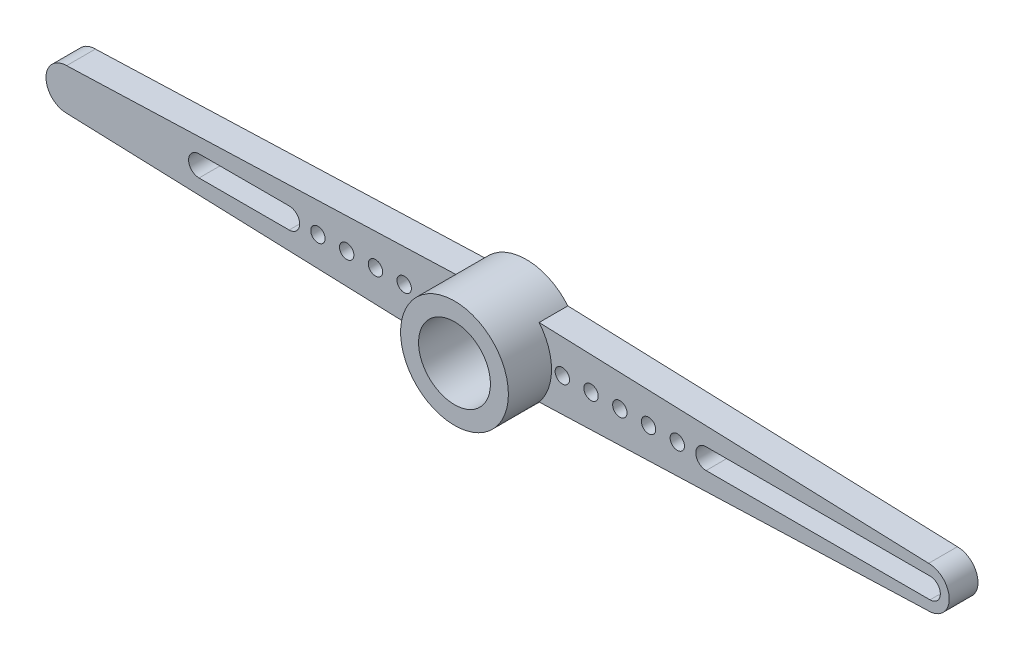
ISO-10303-21;
HEADER;
FILE_DESCRIPTION(('STEP AP214'),'2;1');
FILE_NAME('part.step','',(''),(''),'','','');
FILE_SCHEMA(('AUTOMOTIVE_DESIGN { 1 0 10303 214 1 1 1 1 }'));
ENDSEC;
DATA;
#1=APPLICATION_CONTEXT('core data for automotive mechanical design processes');
#2=APPLICATION_PROTOCOL_DEFINITION('international standard','automotive_design',2000,#1);
#3=PRODUCT_CONTEXT('',#1,'mechanical');
#4=PRODUCT('Part','Part','',(#3));
#5=PRODUCT_RELATED_PRODUCT_CATEGORY('part','',(#4));
#6=PRODUCT_DEFINITION_FORMATION('','',#4);
#7=PRODUCT_DEFINITION_CONTEXT('part definition',#1,'design');
#8=PRODUCT_DEFINITION('design','',#6,#7);
#9=PRODUCT_DEFINITION_SHAPE('','',#8);
#10=(LENGTH_UNIT() NAMED_UNIT(*) SI_UNIT(.MILLI.,.METRE.));
#11=(NAMED_UNIT(*) PLANE_ANGLE_UNIT() SI_UNIT($,.RADIAN.));
#12=(NAMED_UNIT(*) SI_UNIT($,.STERADIAN.) SOLID_ANGLE_UNIT());
#13=UNCERTAINTY_MEASURE_WITH_UNIT(LENGTH_MEASURE(1.E-05),#10,'distance_accuracy_value','');
#14=(GEOMETRIC_REPRESENTATION_CONTEXT(3) GLOBAL_UNCERTAINTY_ASSIGNED_CONTEXT((#13)) GLOBAL_UNIT_ASSIGNED_CONTEXT((#10,
#11,#12)) REPRESENTATION_CONTEXT('',''));
#15=CARTESIAN_POINT('',(0.,0.,0.));
#16=DIRECTION('',(0.,0.,1.));
#17=DIRECTION('',(1.,0.,0.));
#18=AXIS2_PLACEMENT_3D('',#15,#16,#17);
#19=CARTESIAN_POINT('',(0.,0.,0.));
#20=DIRECTION('',(0.,0.,1.));
#21=DIRECTION('',(1.,0.,0.));
#22=AXIS2_PLACEMENT_3D('',#19,#20,#21);
#23=CYLINDRICAL_SURFACE('',#22,2.5);
#24=CARTESIAN_POINT('',(0.,0.,5.));
#25=DIRECTION('',(0.,0.,1.));
#26=DIRECTION('',(1.,0.,0.));
#27=AXIS2_PLACEMENT_3D('',#24,#25,#26);
#28=CIRCLE('',#27,2.5);
#29=CARTESIAN_POINT('',(2.5,0.,5.));
#30=VERTEX_POINT('',#29);
#31=EDGE_CURVE('E299',#30,#30,#28,.T.);
#32=ORIENTED_EDGE('',*,*,#31,.T.);
#33=EDGE_LOOP('',(#32));
#34=FACE_BOUND('',#33,.T.);
#35=CARTESIAN_POINT('',(0.,0.,1.));
#36=DIRECTION('',(0.,0.,-1.));
#37=DIRECTION('',(-1.,0.,0.));
#38=AXIS2_PLACEMENT_3D('',#35,#36,#37);
#39=CIRCLE('',#38,2.5);
#40=CARTESIAN_POINT('',(-2.5,0.,1.));
#41=VERTEX_POINT('',#40);
#42=EDGE_CURVE('E236',#41,#41,#39,.T.);
#43=ORIENTED_EDGE('',*,*,#42,.T.);
#44=EDGE_LOOP('',(#43));
#45=FACE_BOUND('',#44,.T.);
#46=ADVANCED_FACE('F43',(#34,#45),#23,.F.);
#47=CARTESIAN_POINT('',(0.,0.,2.));
#48=DIRECTION('',(0.,0.,1.));
#49=DIRECTION('',(1.,0.,0.));
#50=AXIS2_PLACEMENT_3D('',#47,#48,#49);
#51=PLANE('',#50);
#52=CARTESIAN_POINT('',(-20.7702629513184,2.76649775136915E-07,2.));
#53=DIRECTION('',(0.,0.,-1.));
#54=DIRECTION('',(-1.,0.,0.));
#55=AXIS2_PLACEMENT_3D('',#52,#53,#54);
#56=CIRCLE('',#55,0.726731665091719);
#57=CARTESIAN_POINT('',(-20.7702629513184,-0.726731665091719,2.));
#58=VERTEX_POINT('',#57);
#59=CARTESIAN_POINT('',(-20.7702629513184,0.726731665091719,2.));
#60=VERTEX_POINT('',#59);
#61=EDGE_CURVE('E160',#58,#60,#56,.T.);
#62=ORIENTED_EDGE('',*,*,#61,.T.);
#63=DIRECTION('',(1.,0.,0.));
#64=VECTOR('',#63,1.);
#65=CARTESIAN_POINT('',(-20.7702629513184,0.726731665091719,2.));
#66=LINE('',#65,#64);
#67=CARTESIAN_POINT('',(-14.5,0.726731665091716,2.));
#68=VERTEX_POINT('',#67);
#69=EDGE_CURVE('E169',#60,#68,#66,.T.);
#70=ORIENTED_EDGE('',*,*,#69,.T.);
#71=CARTESIAN_POINT('',(-14.5,0.,2.));
#72=DIRECTION('',(0.,0.,-1.));
#73=DIRECTION('',(-1.,0.,0.));
#74=AXIS2_PLACEMENT_3D('',#71,#72,#73);
#75=CIRCLE('',#74,0.726731665091718);
#76=CARTESIAN_POINT('',(-14.5,-0.72673166509172,2.));
#77=VERTEX_POINT('',#76);
#78=EDGE_CURVE('E60',#68,#77,#75,.T.);
#79=ORIENTED_EDGE('',*,*,#78,.T.);
#80=DIRECTION('',(-1.,0.,0.));
#81=VECTOR('',#80,1.);
#82=CARTESIAN_POINT('',(-20.7702629513184,-0.726731665091719,2.));
#83=LINE('',#82,#81);
#84=EDGE_CURVE('E166',#77,#58,#83,.T.);
#85=ORIENTED_EDGE('',*,*,#84,.T.);
#86=EDGE_LOOP('',(#62,#70,#79,#85));
#87=FACE_BOUND('',#86,.T.);
#88=CARTESIAN_POINT('',(-12.5,0.,2.));
#89=DIRECTION('',(0.,0.,-1.));
#90=DIRECTION('',(-1.,0.,0.));
#91=AXIS2_PLACEMENT_3D('',#88,#89,#90);
#92=CIRCLE('',#91,0.500000000000001);
#93=CARTESIAN_POINT('',(-13.,0.,2.));
#94=VERTEX_POINT('',#93);
#95=EDGE_CURVE('E245',#94,#94,#92,.F.);
#96=ORIENTED_EDGE('',*,*,#95,.F.);
#97=EDGE_LOOP('',(#96));
#98=FACE_BOUND('',#97,.T.);
#99=CARTESIAN_POINT('',(-8.5,0.,2.));
#100=DIRECTION('',(0.,0.,-1.));
#101=DIRECTION('',(-1.,0.,0.));
#102=AXIS2_PLACEMENT_3D('',#99,#100,#101);
#103=CIRCLE('',#102,0.500000000000001);
#104=CARTESIAN_POINT('',(-9.,0.,2.));
#105=VERTEX_POINT('',#104);
#106=EDGE_CURVE('E257',#105,#105,#103,.F.);
#107=ORIENTED_EDGE('',*,*,#106,.F.);
#108=EDGE_LOOP('',(#107));
#109=FACE_BOUND('',#108,.T.);
#110=CARTESIAN_POINT('',(-4.5,0.,2.));
#111=DIRECTION('',(0.,0.,-1.));
#112=DIRECTION('',(-1.,0.,0.));
#113=AXIS2_PLACEMENT_3D('',#110,#111,#112);
#114=CIRCLE('',#113,0.500000000000001);
#115=CARTESIAN_POINT('',(-5.,0.,2.));
#116=VERTEX_POINT('',#115);
#117=EDGE_CURVE('E269',#116,#116,#114,.F.);
#118=ORIENTED_EDGE('',*,*,#117,.F.);
#119=EDGE_LOOP('',(#118));
#120=FACE_BOUND('',#119,.T.);
#121=CARTESIAN_POINT('',(0.,0.,2.));
#122=DIRECTION('',(0.,0.,1.));
#123=DIRECTION('',(1.,0.,0.));
#124=AXIS2_PLACEMENT_3D('',#121,#122,#123);
#125=CIRCLE('',#124,3.75);
#126=CARTESIAN_POINT('',(-2.88547071027724,2.39511143376089,2.));
#127=VERTEX_POINT('',#126);
#128=CARTESIAN_POINT('',(-2.88547071027724,-2.39511143376089,2.));
#129=VERTEX_POINT('',#128);
#130=EDGE_CURVE('E12',#127,#129,#125,.T.);
#131=ORIENTED_EDGE('',*,*,#130,.F.);
#132=DIRECTION('',(0.999372730394994,0.0354139201848026,0.));
#133=VECTOR('',#132,1.);
#134=CARTESIAN_POINT('',(-0.0883858807695831,2.49422934631706,2.));
#135=LINE('',#134,#133);
#136=CARTESIAN_POINT('',(-29.9811819118498,1.43494379594303,2.));
#137=VERTEX_POINT('',#136);
#138=EDGE_CURVE('E321',#137,#127,#135,.T.);
#139=ORIENTED_EDGE('',*,*,#138,.F.);
#140=CARTESIAN_POINT('',(-29.9811819118498,0.,2.));
#141=DIRECTION('',(0.,0.,1.));
#142=DIRECTION('',(1.,0.,0.));
#143=AXIS2_PLACEMENT_3D('',#140,#141,#142);
#144=CIRCLE('',#143,1.43494379594303);
#145=CARTESIAN_POINT('',(-29.9811819118498,-1.43494379594303,2.));
#146=VERTEX_POINT('',#145);
#147=EDGE_CURVE('E308',#146,#137,#144,.F.);
#148=ORIENTED_EDGE('',*,*,#147,.F.);
#149=DIRECTION('',(0.999372730394994,-0.0354139201848024,0.));
#150=VECTOR('',#149,1.);
#151=CARTESIAN_POINT('',(-0.0883858807695825,-2.49422934631706,2.));
#152=LINE('',#151,#150);
#153=EDGE_CURVE('E311',#146,#129,#152,.T.);
#154=ORIENTED_EDGE('',*,*,#153,.T.);
#155=EDGE_LOOP('',(#131,#139,#148,#154));
#156=FACE_BOUND('',#155,.T.);
#157=CARTESIAN_POINT('',(-6.5,0.,2.));
#158=DIRECTION('',(0.,0.,-1.));
#159=DIRECTION('',(-1.,0.,0.));
#160=AXIS2_PLACEMENT_3D('',#157,#158,#159);
#161=CIRCLE('',#160,0.500000000000001);
#162=CARTESIAN_POINT('',(-7.,0.,2.));
#163=VERTEX_POINT('',#162);
#164=EDGE_CURVE('E263',#163,#163,#161,.F.);
#165=ORIENTED_EDGE('',*,*,#164,.F.);
#166=EDGE_LOOP('',(#165));
#167=FACE_BOUND('',#166,.T.);
#168=CARTESIAN_POINT('',(-10.5,0.,2.));
#169=DIRECTION('',(0.,0.,-1.));
#170=DIRECTION('',(-1.,0.,0.));
#171=AXIS2_PLACEMENT_3D('',#168,#169,#170);
#172=CIRCLE('',#171,0.500000000000001);
#173=CARTESIAN_POINT('',(-11.,0.,2.));
#174=VERTEX_POINT('',#173);
#175=EDGE_CURVE('E251',#174,#174,#172,.F.);
#176=ORIENTED_EDGE('',*,*,#175,.F.);
#177=EDGE_LOOP('',(#176));
#178=FACE_BOUND('',#177,.T.);
#179=ADVANCED_FACE('F173',(#87,#98,#109,#120,#156,#167,#178),#51,.T.);
#180=CARTESIAN_POINT('',(0.,0.,0.));
#181=DIRECTION('',(0.,0.,1.));
#182=DIRECTION('',(1.,0.,0.));
#183=AXIS2_PLACEMENT_3D('',#180,#181,#182);
#184=PLANE('',#183);
#185=DIRECTION('',(1.,0.,0.));
#186=VECTOR('',#185,1.);
#187=CARTESIAN_POINT('',(-20.7702629513184,0.726731665091719,0.));
#188=LINE('',#187,#186);
#189=CARTESIAN_POINT('',(-20.7702629513184,0.726731665091719,0.));
#190=VERTEX_POINT('',#189);
#191=CARTESIAN_POINT('',(-14.5,0.726731665091718,0.));
#192=VERTEX_POINT('',#191);
#193=EDGE_CURVE('E185',#190,#192,#188,.T.);
#194=ORIENTED_EDGE('',*,*,#193,.F.);
#195=CARTESIAN_POINT('',(-20.7702629513184,2.76649775136915E-07,0.));
#196=DIRECTION('',(0.,0.,-1.));
#197=DIRECTION('',(-1.,0.,0.));
#198=AXIS2_PLACEMENT_3D('',#195,#196,#197);
#199=CIRCLE('',#198,0.726731665091719);
#200=CARTESIAN_POINT('',(-20.7702629513184,-0.726731665091719,0.));
#201=VERTEX_POINT('',#200);
#202=EDGE_CURVE('E68',#201,#190,#199,.T.);
#203=ORIENTED_EDGE('',*,*,#202,.F.);
#204=DIRECTION('',(-1.,0.,0.));
#205=VECTOR('',#204,1.);
#206=CARTESIAN_POINT('',(-20.7702629513184,-0.726731665091719,0.));
#207=LINE('',#206,#205);
#208=CARTESIAN_POINT('',(-14.5,-0.72673166509172,0.));
#209=VERTEX_POINT('',#208);
#210=EDGE_CURVE('E176',#209,#201,#207,.T.);
#211=ORIENTED_EDGE('',*,*,#210,.F.);
#212=CARTESIAN_POINT('',(-14.5,0.,0.));
#213=DIRECTION('',(0.,0.,-1.));
#214=DIRECTION('',(-1.,0.,0.));
#215=AXIS2_PLACEMENT_3D('',#212,#213,#214);
#216=CIRCLE('',#215,0.726731665091718);
#217=EDGE_CURVE('E179',#192,#209,#216,.T.);
#218=ORIENTED_EDGE('',*,*,#217,.F.);
#219=EDGE_LOOP('',(#194,#203,#211,#218));
#220=FACE_BOUND('',#219,.T.);
#221=DIRECTION('',(1.,0.,0.));
#222=VECTOR('',#221,1.);
#223=CARTESIAN_POINT('',(14.5,0.716032824435331,0.));
#224=LINE('',#223,#222);
#225=CARTESIAN_POINT('',(14.5,0.716032824435331,0.));
#226=VERTEX_POINT('',#225);
#227=CARTESIAN_POINT('',(30.0791053530389,0.716032824435331,0.));
#228=VERTEX_POINT('',#227);
#229=EDGE_CURVE('E212',#226,#228,#224,.T.);
#230=ORIENTED_EDGE('',*,*,#229,.F.);
#231=CARTESIAN_POINT('',(14.5,0.,0.));
#232=DIRECTION('',(0.,0.,-1.));
#233=DIRECTION('',(-1.,0.,0.));
#234=AXIS2_PLACEMENT_3D('',#231,#232,#233);
#235=CIRCLE('',#234,0.716032824435331);
#236=CARTESIAN_POINT('',(14.5,-0.716032824435331,0.));
#237=VERTEX_POINT('',#236);
#238=EDGE_CURVE('E210',#237,#226,#235,.T.);
#239=ORIENTED_EDGE('',*,*,#238,.F.);
#240=DIRECTION('',(-1.,0.,0.));
#241=VECTOR('',#240,1.);
#242=CARTESIAN_POINT('',(14.5,-0.716032824435331,0.));
#243=LINE('',#242,#241);
#244=CARTESIAN_POINT('',(30.0791053530389,-0.716032824435331,0.));
#245=VERTEX_POINT('',#244);
#246=EDGE_CURVE('E200',#245,#237,#243,.T.);
#247=ORIENTED_EDGE('',*,*,#246,.F.);
#248=CARTESIAN_POINT('',(30.0791053530389,0.,0.));
#249=DIRECTION('',(0.,0.,-1.));
#250=DIRECTION('',(-1.,0.,0.));
#251=AXIS2_PLACEMENT_3D('',#248,#249,#250);
#252=CIRCLE('',#251,0.716032824435331);
#253=EDGE_CURVE('E215',#228,#245,#252,.T.);
#254=ORIENTED_EDGE('',*,*,#253,.F.);
#255=EDGE_LOOP('',(#230,#239,#247,#254));
#256=FACE_BOUND('',#255,.T.);
#257=CARTESIAN_POINT('',(0.,0.,0.));
#258=DIRECTION('',(0.,0.,-1.));
#259=DIRECTION('',(-1.,0.,0.));
#260=AXIS2_PLACEMENT_3D('',#257,#258,#259);
#261=CIRCLE('',#260,2.5);
#262=CARTESIAN_POINT('',(-2.5,0.,0.));
#263=VERTEX_POINT('',#262);
#264=EDGE_CURVE('E232',#263,#263,#261,.T.);
#265=ORIENTED_EDGE('',*,*,#264,.F.);
#266=EDGE_LOOP('',(#265));
#267=FACE_BOUND('',#266,.T.);
#268=CARTESIAN_POINT('',(12.5,0.,0.));
#269=DIRECTION('',(0.,0.,-1.));
#270=DIRECTION('',(-1.,0.,0.));
#271=AXIS2_PLACEMENT_3D('',#268,#269,#270);
#272=CIRCLE('',#271,0.500000000000001);
#273=CARTESIAN_POINT('',(12.,0.,0.));
#274=VERTEX_POINT('',#273);
#275=EDGE_CURVE('E242',#274,#274,#272,.T.);
#276=ORIENTED_EDGE('',*,*,#275,.F.);
#277=EDGE_LOOP('',(#276));
#278=FACE_BOUND('',#277,.T.);
#279=CARTESIAN_POINT('',(4.5,0.,0.));
#280=DIRECTION('',(0.,0.,-1.));
#281=DIRECTION('',(-1.,0.,0.));
#282=AXIS2_PLACEMENT_3D('',#279,#280,#281);
#283=CIRCLE('',#282,0.500000000000001);
#284=CARTESIAN_POINT('',(4.,0.,0.));
#285=VERTEX_POINT('',#284);
#286=EDGE_CURVE('E278',#285,#285,#283,.T.);
#287=ORIENTED_EDGE('',*,*,#286,.F.);
#288=EDGE_LOOP('',(#287));
#289=FACE_BOUND('',#288,.T.);
#290=CARTESIAN_POINT('',(6.5,0.,0.));
#291=DIRECTION('',(0.,0.,-1.));
#292=DIRECTION('',(-1.,0.,0.));
#293=AXIS2_PLACEMENT_3D('',#290,#291,#292);
#294=CIRCLE('',#293,0.500000000000001);
#295=CARTESIAN_POINT('',(6.,0.,0.));
#296=VERTEX_POINT('',#295);
#297=EDGE_CURVE('E284',#296,#296,#294,.T.);
#298=ORIENTED_EDGE('',*,*,#297,.F.);
#299=EDGE_LOOP('',(#298));
#300=FACE_BOUND('',#299,.T.);
#301=CARTESIAN_POINT('',(8.5,0.,0.));
#302=DIRECTION('',(0.,0.,-1.));
#303=DIRECTION('',(-1.,0.,0.));
#304=AXIS2_PLACEMENT_3D('',#301,#302,#303);
#305=CIRCLE('',#304,0.500000000000001);
#306=CARTESIAN_POINT('',(8.,0.,0.));
#307=VERTEX_POINT('',#306);
#308=EDGE_CURVE('E290',#307,#307,#305,.T.);
#309=ORIENTED_EDGE('',*,*,#308,.F.);
#310=EDGE_LOOP('',(#309));
#311=FACE_BOUND('',#310,.T.);
#312=CARTESIAN_POINT('',(10.5,0.,0.));
#313=DIRECTION('',(0.,0.,-1.));
#314=DIRECTION('',(-1.,0.,0.));
#315=AXIS2_PLACEMENT_3D('',#312,#313,#314);
#316=CIRCLE('',#315,0.500000000000001);
#317=CARTESIAN_POINT('',(10.,0.,0.));
#318=VERTEX_POINT('',#317);
#319=EDGE_CURVE('E296',#318,#318,#316,.T.);
#320=ORIENTED_EDGE('',*,*,#319,.F.);
#321=EDGE_LOOP('',(#320));
#322=FACE_BOUND('',#321,.T.);
#323=DIRECTION('',(-0.999372730394994,-0.0354139201848029,0.));
#324=VECTOR('',#323,1.);
#325=CARTESIAN_POINT('',(0.0883858807695838,-2.49422934631706,0.));
#326=LINE('',#325,#324);
#327=CARTESIAN_POINT('',(29.9811819118498,-1.43494379594302,0.));
#328=VERTEX_POINT('',#327);
#329=CARTESIAN_POINT('',(2.88547071027724,-2.39511143376089,0.));
#330=VERTEX_POINT('',#329);
#331=EDGE_CURVE('E329',#328,#330,#326,.T.);
#332=ORIENTED_EDGE('',*,*,#331,.T.);
#333=CARTESIAN_POINT('',(0.,0.,0.));
#334=DIRECTION('',(0.,0.,-1.));
#335=DIRECTION('',(-1.,0.,0.));
#336=AXIS2_PLACEMENT_3D('',#333,#334,#335);
#337=CIRCLE('',#336,3.75);
#338=CARTESIAN_POINT('',(-2.88547071027724,-2.39511143376089,0.));
#339=VERTEX_POINT('',#338);
#340=EDGE_CURVE('E326',#330,#339,#337,.T.);
#341=ORIENTED_EDGE('',*,*,#340,.T.);
#342=DIRECTION('',(0.999372730394994,-0.0354139201848024,0.));
#343=VECTOR('',#342,1.);
#344=CARTESIAN_POINT('',(-0.0883858807695825,-2.49422934631706,0.));
#345=LINE('',#344,#343);
#346=CARTESIAN_POINT('',(-29.9811819118498,-1.43494379594303,0.));
#347=VERTEX_POINT('',#346);
#348=EDGE_CURVE('E315',#347,#339,#345,.T.);
#349=ORIENTED_EDGE('',*,*,#348,.F.);
#350=CARTESIAN_POINT('',(-29.9811819118498,0.,0.));
#351=DIRECTION('',(0.,0.,1.));
#352=DIRECTION('',(1.,0.,0.));
#353=AXIS2_PLACEMENT_3D('',#350,#351,#352);
#354=CIRCLE('',#353,1.43494379594303);
#355=CARTESIAN_POINT('',(-29.9811819118498,1.43494379594303,0.));
#356=VERTEX_POINT('',#355);
#357=EDGE_CURVE('E307',#347,#356,#354,.F.);
#358=ORIENTED_EDGE('',*,*,#357,.T.);
#359=DIRECTION('',(0.999372730394994,0.0354139201848026,0.));
#360=VECTOR('',#359,1.);
#361=CARTESIAN_POINT('',(-0.0883858807695831,2.49422934631706,0.));
#362=LINE('',#361,#360);
#363=CARTESIAN_POINT('',(-2.88547071027724,2.39511143376089,0.));
#364=VERTEX_POINT('',#363);
#365=EDGE_CURVE('E312',#356,#364,#362,.T.);
#366=ORIENTED_EDGE('',*,*,#365,.T.);
#367=CARTESIAN_POINT('',(2.88547071027724,2.39511143376089,0.));
#368=VERTEX_POINT('',#367);
#369=EDGE_CURVE('E324',#364,#368,#337,.T.);
#370=ORIENTED_EDGE('',*,*,#369,.T.);
#371=DIRECTION('',(-0.999372730394994,0.0354139201848023,0.));
#372=VECTOR('',#371,1.);
#373=CARTESIAN_POINT('',(0.0883858807695825,2.49422934631706,0.));
#374=LINE('',#373,#372);
#375=CARTESIAN_POINT('',(29.9811819118498,1.43494379594303,0.));
#376=VERTEX_POINT('',#375);
#377=EDGE_CURVE('E338',#376,#368,#374,.T.);
#378=ORIENTED_EDGE('',*,*,#377,.F.);
#379=CARTESIAN_POINT('',(29.9811819118498,0.,0.));
#380=DIRECTION('',(0.,0.,1.));
#381=DIRECTION('',(1.,0.,0.));
#382=AXIS2_PLACEMENT_3D('',#379,#380,#381);
#383=CIRCLE('',#382,1.43494379594303);
#384=EDGE_CURVE('E336',#328,#376,#383,.T.);
#385=ORIENTED_EDGE('',*,*,#384,.F.);
#386=EDGE_LOOP('',(#332,#341,#349,#358,#366,#370,#378,#385));
#387=FACE_BOUND('',#386,.T.);
#388=CARTESIAN_POINT('',(-4.5,0.,0.));
#389=DIRECTION('',(0.,0.,-1.));
#390=DIRECTION('',(-1.,0.,0.));
#391=AXIS2_PLACEMENT_3D('',#388,#389,#390);
#392=CIRCLE('',#391,0.500000000000001);
#393=CARTESIAN_POINT('',(-5.,0.,0.));
#394=VERTEX_POINT('',#393);
#395=EDGE_CURVE('E272',#394,#394,#392,.F.);
#396=ORIENTED_EDGE('',*,*,#395,.T.);
#397=EDGE_LOOP('',(#396));
#398=FACE_BOUND('',#397,.T.);
#399=CARTESIAN_POINT('',(-6.5,0.,0.));
#400=DIRECTION('',(0.,0.,-1.));
#401=DIRECTION('',(-1.,0.,0.));
#402=AXIS2_PLACEMENT_3D('',#399,#400,#401);
#403=CIRCLE('',#402,0.500000000000001);
#404=CARTESIAN_POINT('',(-7.,0.,0.));
#405=VERTEX_POINT('',#404);
#406=EDGE_CURVE('E266',#405,#405,#403,.F.);
#407=ORIENTED_EDGE('',*,*,#406,.T.);
#408=EDGE_LOOP('',(#407));
#409=FACE_BOUND('',#408,.T.);
#410=CARTESIAN_POINT('',(-8.5,0.,0.));
#411=DIRECTION('',(0.,0.,-1.));
#412=DIRECTION('',(-1.,0.,0.));
#413=AXIS2_PLACEMENT_3D('',#410,#411,#412);
#414=CIRCLE('',#413,0.500000000000001);
#415=CARTESIAN_POINT('',(-9.,0.,0.));
#416=VERTEX_POINT('',#415);
#417=EDGE_CURVE('E260',#416,#416,#414,.F.);
#418=ORIENTED_EDGE('',*,*,#417,.T.);
#419=EDGE_LOOP('',(#418));
#420=FACE_BOUND('',#419,.T.);
#421=CARTESIAN_POINT('',(-10.5,0.,0.));
#422=DIRECTION('',(0.,0.,-1.));
#423=DIRECTION('',(-1.,0.,0.));
#424=AXIS2_PLACEMENT_3D('',#421,#422,#423);
#425=CIRCLE('',#424,0.500000000000001);
#426=CARTESIAN_POINT('',(-11.,0.,0.));
#427=VERTEX_POINT('',#426);
#428=EDGE_CURVE('E254',#427,#427,#425,.F.);
#429=ORIENTED_EDGE('',*,*,#428,.T.);
#430=EDGE_LOOP('',(#429));
#431=FACE_BOUND('',#430,.T.);
#432=CARTESIAN_POINT('',(-12.5,0.,0.));
#433=DIRECTION('',(0.,0.,-1.));
#434=DIRECTION('',(-1.,0.,0.));
#435=AXIS2_PLACEMENT_3D('',#432,#433,#434);
#436=CIRCLE('',#435,0.500000000000001);
#437=CARTESIAN_POINT('',(-13.,0.,0.));
#438=VERTEX_POINT('',#437);
#439=EDGE_CURVE('E248',#438,#438,#436,.F.);
#440=ORIENTED_EDGE('',*,*,#439,.T.);
#441=EDGE_LOOP('',(#440));
#442=FACE_BOUND('',#441,.T.);
#443=ADVANCED_FACE('F385',(#220,#256,#267,#278,#289,#300,#311,#322,#387,#398,#409,#420,#431,
#442),#184,.F.);
#444=CARTESIAN_POINT('',(0.0883858807695838,-2.49422934631706,2.));
#445=DIRECTION('',(0.0354139201848029,-0.999372730394994,0.));
#446=DIRECTION('',(0.999372730394994,0.0354139201848029,0.));
#447=AXIS2_PLACEMENT_3D('',#444,#445,#446);
#448=PLANE('',#447);
#449=ORIENTED_EDGE('',*,*,#331,.F.);
#450=DIRECTION('',(0.,0.,-1.));
#451=VECTOR('',#450,1.);
#452=CARTESIAN_POINT('',(29.9811819118498,-1.43494379594302,2.));
#453=LINE('',#452,#451);
#454=CARTESIAN_POINT('',(29.9811819118498,-1.43494379594302,2.));
#455=VERTEX_POINT('',#454);
#456=EDGE_CURVE('E344',#455,#328,#453,.T.);
#457=ORIENTED_EDGE('',*,*,#456,.F.);
#458=DIRECTION('',(-0.999372730394994,-0.0354139201848029,0.));
#459=VECTOR('',#458,1.);
#460=CARTESIAN_POINT('',(0.0883858807695838,-2.49422934631706,2.));
#461=LINE('',#460,#459);
#462=CARTESIAN_POINT('',(2.88547071027724,-2.39511143376089,2.));
#463=VERTEX_POINT('',#462);
#464=EDGE_CURVE('E333',#455,#463,#461,.T.);
#465=ORIENTED_EDGE('',*,*,#464,.T.);
#466=DIRECTION('',(0.,0.,-1.));
#467=VECTOR('',#466,1.);
#468=CARTESIAN_POINT('',(2.88547071027724,-2.39511143376089,2.));
#469=LINE('',#468,#467);
#470=EDGE_CURVE('E359',#463,#330,#469,.T.);
#471=ORIENTED_EDGE('',*,*,#470,.T.);
#472=EDGE_LOOP('',(#449,#457,#465,#471));
#473=FACE_BOUND('',#472,.T.);
#474=ADVANCED_FACE('F45',(#473),#448,.T.);
#475=CARTESIAN_POINT('',(29.9811819118498,0.,2.));
#476=DIRECTION('',(0.,0.,-1.));
#477=DIRECTION('',(-1.,0.,0.));
#478=AXIS2_PLACEMENT_3D('',#475,#476,#477);
#479=CYLINDRICAL_SURFACE('',#478,1.43494379594303);
#480=ORIENTED_EDGE('',*,*,#384,.T.);
#481=DIRECTION('',(0.,0.,-1.));
#482=VECTOR('',#481,1.);
#483=CARTESIAN_POINT('',(29.9811819118498,1.43494379594303,2.));
#484=LINE('',#483,#482);
#485=CARTESIAN_POINT('',(29.9811819118498,1.43494379594303,2.));
#486=VERTEX_POINT('',#485);
#487=EDGE_CURVE('E341',#486,#376,#484,.T.);
#488=ORIENTED_EDGE('',*,*,#487,.F.);
#489=CARTESIAN_POINT('',(29.9811819118498,0.,2.));
#490=DIRECTION('',(0.,0.,1.));
#491=DIRECTION('',(1.,0.,0.));
#492=AXIS2_PLACEMENT_3D('',#489,#490,#491);
#493=CIRCLE('',#492,1.43494379594303);
#494=EDGE_CURVE('E330',#455,#486,#493,.T.);
#495=ORIENTED_EDGE('',*,*,#494,.F.);
#496=ORIENTED_EDGE('',*,*,#456,.T.);
#497=EDGE_LOOP('',(#480,#488,#495,#496));
#498=FACE_BOUND('',#497,.T.);
#499=ADVANCED_FACE('F391',(#498),#479,.T.);
#500=CARTESIAN_POINT('',(0.0883858807695825,2.49422934631706,2.));
#501=DIRECTION('',(-0.0354139201848023,-0.999372730394994,0.));
#502=DIRECTION('',(0.999372730394994,-0.0354139201848023,0.));
#503=AXIS2_PLACEMENT_3D('',#500,#501,#502);
#504=PLANE('',#503);
#505=ORIENTED_EDGE('',*,*,#377,.T.);
#506=DIRECTION('',(0.,0.,-1.));
#507=VECTOR('',#506,1.);
#508=CARTESIAN_POINT('',(2.88547071027724,2.39511143376089,2.));
#509=LINE('',#508,#507);
#510=CARTESIAN_POINT('',(2.88547071027724,2.39511143376089,2.));
#511=VERTEX_POINT('',#510);
#512=EDGE_CURVE('E345',#511,#368,#509,.T.);
#513=ORIENTED_EDGE('',*,*,#512,.F.);
#514=DIRECTION('',(-0.999372730394994,0.0354139201848023,0.));
#515=VECTOR('',#514,1.);
#516=CARTESIAN_POINT('',(0.0883858807695825,2.49422934631706,2.));
#517=LINE('',#516,#515);
#518=EDGE_CURVE('E332',#486,#511,#517,.T.);
#519=ORIENTED_EDGE('',*,*,#518,.F.);
#520=ORIENTED_EDGE('',*,*,#487,.T.);
#521=EDGE_LOOP('',(#505,#513,#519,#520));
#522=FACE_BOUND('',#521,.T.);
#523=ADVANCED_FACE('F393',(#522),#504,.F.);
#524=CARTESIAN_POINT('',(14.5,0.,2.));
#525=DIRECTION('',(0.,0.,-1.));
#526=DIRECTION('',(-1.,0.,0.));
#527=AXIS2_PLACEMENT_3D('',#524,#525,#526);
#528=CIRCLE('',#527,0.716032824435331);
#529=CARTESIAN_POINT('',(14.5,-0.716032824435331,2.));
#530=VERTEX_POINT('',#529);
#531=CARTESIAN_POINT('',(14.5,0.716032824435331,2.));
#532=VERTEX_POINT('',#531);
#533=EDGE_CURVE('E196',#530,#532,#528,.T.);
#534=ORIENTED_EDGE('',*,*,#533,.T.);
#535=DIRECTION('',(1.,0.,0.));
#536=VECTOR('',#535,1.);
#537=CARTESIAN_POINT('',(14.5,0.716032824435331,2.));
#538=LINE('',#537,#536);
#539=CARTESIAN_POINT('',(30.0791053530389,0.716032824435331,2.));
#540=VERTEX_POINT('',#539);
#541=EDGE_CURVE('E199',#532,#540,#538,.T.);
#542=ORIENTED_EDGE('',*,*,#541,.T.);
#543=CARTESIAN_POINT('',(30.0791053530389,0.,2.));
#544=DIRECTION('',(0.,0.,-1.));
#545=DIRECTION('',(-1.,0.,0.));
#546=AXIS2_PLACEMENT_3D('',#543,#544,#545);
#547=CIRCLE('',#546,0.716032824435331);
#548=CARTESIAN_POINT('',(30.0791053530389,-0.716032824435331,2.));
#549=VERTEX_POINT('',#548);
#550=EDGE_CURVE('E203',#540,#549,#547,.T.);
#551=ORIENTED_EDGE('',*,*,#550,.T.);
#552=DIRECTION('',(-1.,0.,0.));
#553=VECTOR('',#552,1.);
#554=CARTESIAN_POINT('',(14.5,-0.716032824435331,2.));
#555=LINE('',#554,#553);
#556=EDGE_CURVE('E206',#549,#530,#555,.T.);
#557=ORIENTED_EDGE('',*,*,#556,.T.);
#558=EDGE_LOOP('',(#534,#542,#551,#557));
#559=FACE_BOUND('',#558,.T.);
#560=CARTESIAN_POINT('',(12.5,0.,2.));
#561=DIRECTION('',(0.,0.,-1.));
#562=DIRECTION('',(-1.,0.,0.));
#563=AXIS2_PLACEMENT_3D('',#560,#561,#562);
#564=CIRCLE('',#563,0.500000000000001);
#565=CARTESIAN_POINT('',(12.,0.,2.));
#566=VERTEX_POINT('',#565);
#567=EDGE_CURVE('E241',#566,#566,#564,.T.);
#568=ORIENTED_EDGE('',*,*,#567,.T.);
#569=EDGE_LOOP('',(#568));
#570=FACE_BOUND('',#569,.T.);
#571=CARTESIAN_POINT('',(4.5,0.,2.));
#572=DIRECTION('',(0.,0.,-1.));
#573=DIRECTION('',(-1.,0.,0.));
#574=AXIS2_PLACEMENT_3D('',#571,#572,#573);
#575=CIRCLE('',#574,0.500000000000001);
#576=CARTESIAN_POINT('',(4.,0.,2.));
#577=VERTEX_POINT('',#576);
#578=EDGE_CURVE('E275',#577,#577,#575,.T.);
#579=ORIENTED_EDGE('',*,*,#578,.T.);
#580=EDGE_LOOP('',(#579));
#581=FACE_BOUND('',#580,.T.);
#582=CARTESIAN_POINT('',(6.5,0.,2.));
#583=DIRECTION('',(0.,0.,-1.));
#584=DIRECTION('',(-1.,0.,0.));
#585=AXIS2_PLACEMENT_3D('',#582,#583,#584);
#586=CIRCLE('',#585,0.500000000000001);
#587=CARTESIAN_POINT('',(6.,0.,2.));
#588=VERTEX_POINT('',#587);
#589=EDGE_CURVE('E281',#588,#588,#586,.T.);
#590=ORIENTED_EDGE('',*,*,#589,.T.);
#591=EDGE_LOOP('',(#590));
#592=FACE_BOUND('',#591,.T.);
#593=CARTESIAN_POINT('',(8.5,0.,2.));
#594=DIRECTION('',(0.,0.,-1.));
#595=DIRECTION('',(-1.,0.,0.));
#596=AXIS2_PLACEMENT_3D('',#593,#594,#595);
#597=CIRCLE('',#596,0.500000000000001);
#598=CARTESIAN_POINT('',(8.,0.,2.));
#599=VERTEX_POINT('',#598);
#600=EDGE_CURVE('E287',#599,#599,#597,.T.);
#601=ORIENTED_EDGE('',*,*,#600,.T.);
#602=EDGE_LOOP('',(#601));
#603=FACE_BOUND('',#602,.T.);
#604=CARTESIAN_POINT('',(10.5,0.,2.));
#605=DIRECTION('',(0.,0.,-1.));
#606=DIRECTION('',(-1.,0.,0.));
#607=AXIS2_PLACEMENT_3D('',#604,#605,#606);
#608=CIRCLE('',#607,0.500000000000001);
#609=CARTESIAN_POINT('',(10.,0.,2.));
#610=VERTEX_POINT('',#609);
#611=EDGE_CURVE('E293',#610,#610,#608,.T.);
#612=ORIENTED_EDGE('',*,*,#611,.T.);
#613=EDGE_LOOP('',(#612));
#614=FACE_BOUND('',#613,.T.);
#615=EDGE_CURVE('E52',#463,#511,#125,.T.);
#616=ORIENTED_EDGE('',*,*,#615,.F.);
#617=ORIENTED_EDGE('',*,*,#464,.F.);
#618=ORIENTED_EDGE('',*,*,#494,.T.);
#619=ORIENTED_EDGE('',*,*,#518,.T.);
#620=EDGE_LOOP('',(#616,#617,#618,#619));
#621=FACE_BOUND('',#620,.T.);
#622=ADVANCED_FACE('F372',(#559,#570,#581,#592,#603,#614,#621),#51,.T.);
#623=CARTESIAN_POINT('',(0.,0.,0.));
#624=DIRECTION('',(0.,0.,1.));
#625=DIRECTION('',(1.,0.,0.));
#626=AXIS2_PLACEMENT_3D('',#623,#624,#625);
#627=CYLINDRICAL_SURFACE('',#626,3.75);
#628=ORIENTED_EDGE('',*,*,#369,.F.);
#629=DIRECTION('',(0.,0.,-1.));
#630=VECTOR('',#629,1.);
#631=CARTESIAN_POINT('',(-2.88547071027724,2.39511143376089,2.));
#632=LINE('',#631,#630);
#633=EDGE_CURVE('E320',#127,#364,#632,.T.);
#634=ORIENTED_EDGE('',*,*,#633,.F.);
#635=ORIENTED_EDGE('',*,*,#130,.T.);
#636=DIRECTION('',(0.,0.,-1.));
#637=VECTOR('',#636,1.);
#638=CARTESIAN_POINT('',(-2.88547071027724,-2.39511143376089,2.));
#639=LINE('',#638,#637);
#640=EDGE_CURVE('E325',#129,#339,#639,.T.);
#641=ORIENTED_EDGE('',*,*,#640,.T.);
#642=ORIENTED_EDGE('',*,*,#340,.F.);
#643=ORIENTED_EDGE('',*,*,#470,.F.);
#644=ORIENTED_EDGE('',*,*,#615,.T.);
#645=ORIENTED_EDGE('',*,*,#512,.T.);
#646=EDGE_LOOP('',(#628,#634,#635,#641,#642,#643,#644,#645));
#647=FACE_BOUND('',#646,.T.);
#648=CARTESIAN_POINT('',(0.,0.,5.));
#649=DIRECTION('',(0.,0.,1.));
#650=DIRECTION('',(1.,0.,0.));
#651=AXIS2_PLACEMENT_3D('',#648,#649,#650);
#652=CIRCLE('',#651,3.75);
#653=CARTESIAN_POINT('',(3.75,0.,5.));
#654=VERTEX_POINT('',#653);
#655=EDGE_CURVE('E304',#654,#654,#652,.T.);
#656=ORIENTED_EDGE('',*,*,#655,.F.);
#657=EDGE_LOOP('',(#656));
#658=FACE_BOUND('',#657,.T.);
#659=ADVANCED_FACE('F379',(#647,#658),#627,.T.);
#660=CARTESIAN_POINT('',(-29.9811819118498,0.,2.));
#661=DIRECTION('',(0.,0.,-1.));
#662=DIRECTION('',(-1.,0.,0.));
#663=AXIS2_PLACEMENT_3D('',#660,#661,#662);
#664=CYLINDRICAL_SURFACE('',#663,1.43494379594303);
#665=ORIENTED_EDGE('',*,*,#357,.F.);
#666=DIRECTION('',(0.,0.,-1.));
#667=VECTOR('',#666,1.);
#668=CARTESIAN_POINT('',(-29.9811819118498,-1.43494379594303,2.));
#669=LINE('',#668,#667);
#670=EDGE_CURVE('E322',#146,#347,#669,.T.);
#671=ORIENTED_EDGE('',*,*,#670,.F.);
#672=ORIENTED_EDGE('',*,*,#147,.T.);
#673=DIRECTION('',(0.,0.,-1.));
#674=VECTOR('',#673,1.);
#675=CARTESIAN_POINT('',(-29.9811819118498,1.43494379594303,2.));
#676=LINE('',#675,#674);
#677=EDGE_CURVE('E318',#137,#356,#676,.T.);
#678=ORIENTED_EDGE('',*,*,#677,.T.);
#679=EDGE_LOOP('',(#665,#671,#672,#678));
#680=FACE_BOUND('',#679,.T.);
#681=ADVANCED_FACE('F417',(#680),#664,.T.);
#682=CARTESIAN_POINT('',(-0.0883858807695825,-2.49422934631706,2.));
#683=DIRECTION('',(0.0354139201848024,0.999372730394994,0.));
#684=DIRECTION('',(-0.999372730394994,0.0354139201848024,0.));
#685=AXIS2_PLACEMENT_3D('',#682,#683,#684);
#686=PLANE('',#685);
#687=ORIENTED_EDGE('',*,*,#348,.T.);
#688=ORIENTED_EDGE('',*,*,#640,.F.);
#689=ORIENTED_EDGE('',*,*,#153,.F.);
#690=ORIENTED_EDGE('',*,*,#670,.T.);
#691=EDGE_LOOP('',(#687,#688,#689,#690));
#692=FACE_BOUND('',#691,.T.);
#693=ADVANCED_FACE('F415',(#692),#686,.F.);
#694=CARTESIAN_POINT('',(-0.0883858807695831,2.49422934631706,2.));
#695=DIRECTION('',(-0.0354139201848026,0.999372730394994,0.));
#696=DIRECTION('',(-0.999372730394994,-0.0354139201848026,0.));
#697=AXIS2_PLACEMENT_3D('',#694,#695,#696);
#698=PLANE('',#697);
#699=ORIENTED_EDGE('',*,*,#365,.F.);
#700=ORIENTED_EDGE('',*,*,#677,.F.);
#701=ORIENTED_EDGE('',*,*,#138,.T.);
#702=ORIENTED_EDGE('',*,*,#633,.T.);
#703=EDGE_LOOP('',(#699,#700,#701,#702));
#704=FACE_BOUND('',#703,.T.);
#705=ADVANCED_FACE('F400',(#704),#698,.T.);
#706=CARTESIAN_POINT('',(0.,0.,5.));
#707=DIRECTION('',(0.,0.,1.));
#708=DIRECTION('',(1.,0.,0.));
#709=AXIS2_PLACEMENT_3D('',#706,#707,#708);
#710=PLANE('',#709);
#711=ORIENTED_EDGE('',*,*,#655,.T.);
#712=EDGE_LOOP('',(#711));
#713=FACE_BOUND('',#712,.T.);
#714=ORIENTED_EDGE('',*,*,#31,.F.);
#715=EDGE_LOOP('',(#714));
#716=FACE_BOUND('',#715,.T.);
#717=ADVANCED_FACE('F606',(#713,#716),#710,.T.);
#718=CARTESIAN_POINT('',(10.5,0.,2.));
#719=DIRECTION('',(0.,0.,-1.));
#720=DIRECTION('',(-1.,0.,0.));
#721=AXIS2_PLACEMENT_3D('',#718,#719,#720);
#722=CYLINDRICAL_SURFACE('',#721,0.500000000000001);
#723=ORIENTED_EDGE('',*,*,#611,.F.);
#724=EDGE_LOOP('',(#723));
#725=FACE_BOUND('',#724,.T.);
#726=ORIENTED_EDGE('',*,*,#319,.T.);
#727=EDGE_LOOP('',(#726));
#728=FACE_BOUND('',#727,.T.);
#729=ADVANCED_FACE('F597',(#725,#728),#722,.F.);
#730=CARTESIAN_POINT('',(8.5,0.,2.));
#731=DIRECTION('',(0.,0.,-1.));
#732=DIRECTION('',(-1.,0.,0.));
#733=AXIS2_PLACEMENT_3D('',#730,#731,#732);
#734=CYLINDRICAL_SURFACE('',#733,0.500000000000001);
#735=ORIENTED_EDGE('',*,*,#600,.F.);
#736=EDGE_LOOP('',(#735));
#737=FACE_BOUND('',#736,.T.);
#738=ORIENTED_EDGE('',*,*,#308,.T.);
#739=EDGE_LOOP('',(#738));
#740=FACE_BOUND('',#739,.T.);
#741=ADVANCED_FACE('F587',(#737,#740),#734,.F.);
#742=CARTESIAN_POINT('',(6.5,0.,2.));
#743=DIRECTION('',(0.,0.,-1.));
#744=DIRECTION('',(-1.,0.,0.));
#745=AXIS2_PLACEMENT_3D('',#742,#743,#744);
#746=CYLINDRICAL_SURFACE('',#745,0.500000000000001);
#747=ORIENTED_EDGE('',*,*,#589,.F.);
#748=EDGE_LOOP('',(#747));
#749=FACE_BOUND('',#748,.T.);
#750=ORIENTED_EDGE('',*,*,#297,.T.);
#751=EDGE_LOOP('',(#750));
#752=FACE_BOUND('',#751,.T.);
#753=ADVANCED_FACE('F577',(#749,#752),#746,.F.);
#754=CARTESIAN_POINT('',(4.5,0.,2.));
#755=DIRECTION('',(0.,0.,-1.));
#756=DIRECTION('',(-1.,0.,0.));
#757=AXIS2_PLACEMENT_3D('',#754,#755,#756);
#758=CYLINDRICAL_SURFACE('',#757,0.500000000000001);
#759=ORIENTED_EDGE('',*,*,#578,.F.);
#760=EDGE_LOOP('',(#759));
#761=FACE_BOUND('',#760,.T.);
#762=ORIENTED_EDGE('',*,*,#286,.T.);
#763=EDGE_LOOP('',(#762));
#764=FACE_BOUND('',#763,.T.);
#765=ADVANCED_FACE('F567',(#761,#764),#758,.F.);
#766=CARTESIAN_POINT('',(-4.5,0.,2.));
#767=DIRECTION('',(0.,0.,-1.));
#768=DIRECTION('',(-1.,0.,0.));
#769=AXIS2_PLACEMENT_3D('',#766,#767,#768);
#770=CYLINDRICAL_SURFACE('',#769,0.500000000000001);
#771=ORIENTED_EDGE('',*,*,#117,.T.);
#772=EDGE_LOOP('',(#771));
#773=FACE_BOUND('',#772,.T.);
#774=ORIENTED_EDGE('',*,*,#395,.F.);
#775=EDGE_LOOP('',(#774));
#776=FACE_BOUND('',#775,.T.);
#777=ADVANCED_FACE('F557',(#773,#776),#770,.F.);
#778=CARTESIAN_POINT('',(-6.5,0.,2.));
#779=DIRECTION('',(0.,0.,-1.));
#780=DIRECTION('',(-1.,0.,0.));
#781=AXIS2_PLACEMENT_3D('',#778,#779,#780);
#782=CYLINDRICAL_SURFACE('',#781,0.500000000000001);
#783=ORIENTED_EDGE('',*,*,#164,.T.);
#784=EDGE_LOOP('',(#783));
#785=FACE_BOUND('',#784,.T.);
#786=ORIENTED_EDGE('',*,*,#406,.F.);
#787=EDGE_LOOP('',(#786));
#788=FACE_BOUND('',#787,.T.);
#789=ADVANCED_FACE('F547',(#785,#788),#782,.F.);
#790=CARTESIAN_POINT('',(-8.5,0.,2.));
#791=DIRECTION('',(0.,0.,-1.));
#792=DIRECTION('',(-1.,0.,0.));
#793=AXIS2_PLACEMENT_3D('',#790,#791,#792);
#794=CYLINDRICAL_SURFACE('',#793,0.500000000000001);
#795=ORIENTED_EDGE('',*,*,#106,.T.);
#796=EDGE_LOOP('',(#795));
#797=FACE_BOUND('',#796,.T.);
#798=ORIENTED_EDGE('',*,*,#417,.F.);
#799=EDGE_LOOP('',(#798));
#800=FACE_BOUND('',#799,.T.);
#801=ADVANCED_FACE('F537',(#797,#800),#794,.F.);
#802=CARTESIAN_POINT('',(-10.5,0.,2.));
#803=DIRECTION('',(0.,0.,-1.));
#804=DIRECTION('',(-1.,0.,0.));
#805=AXIS2_PLACEMENT_3D('',#802,#803,#804);
#806=CYLINDRICAL_SURFACE('',#805,0.500000000000001);
#807=ORIENTED_EDGE('',*,*,#175,.T.);
#808=EDGE_LOOP('',(#807));
#809=FACE_BOUND('',#808,.T.);
#810=ORIENTED_EDGE('',*,*,#428,.F.);
#811=EDGE_LOOP('',(#810));
#812=FACE_BOUND('',#811,.T.);
#813=ADVANCED_FACE('F527',(#809,#812),#806,.F.);
#814=CARTESIAN_POINT('',(-12.5,0.,2.));
#815=DIRECTION('',(0.,0.,-1.));
#816=DIRECTION('',(-1.,0.,0.));
#817=AXIS2_PLACEMENT_3D('',#814,#815,#816);
#818=CYLINDRICAL_SURFACE('',#817,0.500000000000001);
#819=ORIENTED_EDGE('',*,*,#95,.T.);
#820=EDGE_LOOP('',(#819));
#821=FACE_BOUND('',#820,.T.);
#822=ORIENTED_EDGE('',*,*,#439,.F.);
#823=EDGE_LOOP('',(#822));
#824=FACE_BOUND('',#823,.T.);
#825=ADVANCED_FACE('F517',(#821,#824),#818,.F.);
#826=CARTESIAN_POINT('',(12.5,0.,2.));
#827=DIRECTION('',(0.,0.,-1.));
#828=DIRECTION('',(-1.,0.,0.));
#829=AXIS2_PLACEMENT_3D('',#826,#827,#828);
#830=CYLINDRICAL_SURFACE('',#829,0.500000000000001);
#831=ORIENTED_EDGE('',*,*,#567,.F.);
#832=EDGE_LOOP('',(#831));
#833=FACE_BOUND('',#832,.T.);
#834=ORIENTED_EDGE('',*,*,#275,.T.);
#835=EDGE_LOOP('',(#834));
#836=FACE_BOUND('',#835,.T.);
#837=ADVANCED_FACE('F495',(#833,#836),#830,.F.);
#838=CARTESIAN_POINT('',(0.,0.,1.));
#839=DIRECTION('',(0.,0.,-1.));
#840=DIRECTION('',(-1.,0.,0.));
#841=AXIS2_PLACEMENT_3D('',#838,#839,#840);
#842=PLANE('',#841);
#843=CARTESIAN_POINT('',(0.,0.,1.));
#844=DIRECTION('',(0.,0.,-1.));
#845=DIRECTION('',(-1.,0.,0.));
#846=AXIS2_PLACEMENT_3D('',#843,#844,#845);
#847=CIRCLE('',#846,1.25);
#848=CARTESIAN_POINT('',(-1.25,0.,1.));
#849=VERTEX_POINT('',#848);
#850=EDGE_CURVE('E229',#849,#849,#847,.T.);
#851=ORIENTED_EDGE('',*,*,#850,.T.);
#852=EDGE_LOOP('',(#851));
#853=FACE_BOUND('',#852,.T.);
#854=ORIENTED_EDGE('',*,*,#42,.F.);
#855=EDGE_LOOP('',(#854));
#856=FACE_BOUND('',#855,.T.);
#857=ADVANCED_FACE('F490',(#853,#856),#842,.F.);
#858=CARTESIAN_POINT('',(0.,0.,0.5));
#859=DIRECTION('',(0.,0.,-1.));
#860=DIRECTION('',(-1.,0.,0.));
#861=AXIS2_PLACEMENT_3D('',#858,#859,#860);
#862=CYLINDRICAL_SURFACE('',#861,2.5);
#863=CARTESIAN_POINT('',(0.,0.,0.5));
#864=DIRECTION('',(0.,0.,-1.));
#865=DIRECTION('',(-1.,0.,0.));
#866=AXIS2_PLACEMENT_3D('',#863,#864,#865);
#867=CIRCLE('',#866,2.5);
#868=CARTESIAN_POINT('',(-2.5,0.,0.5));
#869=VERTEX_POINT('',#868);
#870=EDGE_CURVE('E233',#869,#869,#867,.T.);
#871=ORIENTED_EDGE('',*,*,#870,.F.);
#872=EDGE_LOOP('',(#871));
#873=FACE_BOUND('',#872,.T.);
#874=ORIENTED_EDGE('',*,*,#264,.T.);
#875=EDGE_LOOP('',(#874));
#876=FACE_BOUND('',#875,.T.);
#877=ADVANCED_FACE('F482',(#873,#876),#862,.F.);
#878=CARTESIAN_POINT('',(0.,0.,0.5));
#879=DIRECTION('',(0.,0.,-1.));
#880=DIRECTION('',(-1.,0.,0.));
#881=AXIS2_PLACEMENT_3D('',#878,#879,#880);
#882=PLANE('',#881);
#883=CARTESIAN_POINT('',(0.,0.,0.5));
#884=DIRECTION('',(0.,0.,-1.));
#885=DIRECTION('',(-1.,0.,0.));
#886=AXIS2_PLACEMENT_3D('',#883,#884,#885);
#887=CIRCLE('',#886,1.25);
#888=CARTESIAN_POINT('',(-1.25,0.,0.5));
#889=VERTEX_POINT('',#888);
#890=EDGE_CURVE('E192',#889,#889,#887,.T.);
#891=ORIENTED_EDGE('',*,*,#890,.F.);
#892=EDGE_LOOP('',(#891));
#893=FACE_BOUND('',#892,.T.);
#894=ORIENTED_EDGE('',*,*,#870,.T.);
#895=EDGE_LOOP('',(#894));
#896=FACE_BOUND('',#895,.T.);
#897=ADVANCED_FACE('F470',(#893,#896),#882,.T.);
#898=CARTESIAN_POINT('',(0.,0.,5.5));
#899=DIRECTION('',(0.,0.,-1.));
#900=DIRECTION('',(-1.,0.,0.));
#901=AXIS2_PLACEMENT_3D('',#898,#899,#900);
#902=CYLINDRICAL_SURFACE('',#901,1.25);
#903=ORIENTED_EDGE('',*,*,#890,.T.);
#904=EDGE_LOOP('',(#903));
#905=FACE_BOUND('',#904,.T.);
#906=ORIENTED_EDGE('',*,*,#850,.F.);
#907=EDGE_LOOP('',(#906));
#908=FACE_BOUND('',#907,.T.);
#909=ADVANCED_FACE('F464',(#905,#908),#902,.F.);
#910=CARTESIAN_POINT('',(14.5,0.,2.));
#911=DIRECTION('',(0.,0.,-1.));
#912=DIRECTION('',(-1.,0.,0.));
#913=AXIS2_PLACEMENT_3D('',#910,#911,#912);
#914=CYLINDRICAL_SURFACE('',#913,0.716032824435331);
#915=ORIENTED_EDGE('',*,*,#238,.T.);
#916=DIRECTION('',(0.,0.,-1.));
#917=VECTOR('',#916,1.);
#918=CARTESIAN_POINT('',(14.5,0.716032824435331,2.));
#919=LINE('',#918,#917);
#920=EDGE_CURVE('E209',#532,#226,#919,.T.);
#921=ORIENTED_EDGE('',*,*,#920,.F.);
#922=ORIENTED_EDGE('',*,*,#533,.F.);
#923=DIRECTION('',(0.,0.,-1.));
#924=VECTOR('',#923,1.);
#925=CARTESIAN_POINT('',(14.5,-0.716032824435331,2.));
#926=LINE('',#925,#924);
#927=EDGE_CURVE('E186',#530,#237,#926,.T.);
#928=ORIENTED_EDGE('',*,*,#927,.T.);
#929=EDGE_LOOP('',(#915,#921,#922,#928));
#930=FACE_BOUND('',#929,.T.);
#931=ADVANCED_FACE('F469',(#930),#914,.F.);
#932=CARTESIAN_POINT('',(14.5,-0.716032824435331,2.));
#933=DIRECTION('',(0.,-1.,0.));
#934=DIRECTION('',(0.,0.,-1.));
#935=AXIS2_PLACEMENT_3D('',#932,#933,#934);
#936=PLANE('',#935);
#937=ORIENTED_EDGE('',*,*,#246,.T.);
#938=ORIENTED_EDGE('',*,*,#927,.F.);
#939=ORIENTED_EDGE('',*,*,#556,.F.);
#940=DIRECTION('',(0.,0.,-1.));
#941=VECTOR('',#940,1.);
#942=CARTESIAN_POINT('',(30.0791053530389,-0.716032824435331,2.));
#943=LINE('',#942,#941);
#944=EDGE_CURVE('E221',#549,#245,#943,.T.);
#945=ORIENTED_EDGE('',*,*,#944,.T.);
#946=EDGE_LOOP('',(#937,#938,#939,#945));
#947=FACE_BOUND('',#946,.T.);
#948=ADVANCED_FACE('F662',(#947),#936,.F.);
#949=CARTESIAN_POINT('',(30.0791053530389,0.,2.));
#950=DIRECTION('',(0.,0.,-1.));
#951=DIRECTION('',(-1.,0.,0.));
#952=AXIS2_PLACEMENT_3D('',#949,#950,#951);
#953=CYLINDRICAL_SURFACE('',#952,0.716032824435331);
#954=ORIENTED_EDGE('',*,*,#253,.T.);
#955=ORIENTED_EDGE('',*,*,#944,.F.);
#956=ORIENTED_EDGE('',*,*,#550,.F.);
#957=DIRECTION('',(0.,0.,-1.));
#958=VECTOR('',#957,1.);
#959=CARTESIAN_POINT('',(30.0791053530389,0.716032824435331,2.));
#960=LINE('',#959,#958);
#961=EDGE_CURVE('E223',#540,#228,#960,.T.);
#962=ORIENTED_EDGE('',*,*,#961,.T.);
#963=EDGE_LOOP('',(#954,#955,#956,#962));
#964=FACE_BOUND('',#963,.T.);
#965=ADVANCED_FACE('F672',(#964),#953,.F.);
#966=CARTESIAN_POINT('',(14.5,0.716032824435331,2.));
#967=DIRECTION('',(0.,1.,0.));
#968=DIRECTION('',(0.,0.,1.));
#969=AXIS2_PLACEMENT_3D('',#966,#967,#968);
#970=PLANE('',#969);
#971=ORIENTED_EDGE('',*,*,#229,.T.);
#972=ORIENTED_EDGE('',*,*,#961,.F.);
#973=ORIENTED_EDGE('',*,*,#541,.F.);
#974=ORIENTED_EDGE('',*,*,#920,.T.);
#975=EDGE_LOOP('',(#971,#972,#973,#974));
#976=FACE_BOUND('',#975,.T.);
#977=ADVANCED_FACE('F682',(#976),#970,.F.);
#978=CARTESIAN_POINT('',(-20.7702629513184,2.76649775136915E-07,2.));
#979=DIRECTION('',(0.,0.,-1.));
#980=DIRECTION('',(-1.,0.,0.));
#981=AXIS2_PLACEMENT_3D('',#978,#979,#980);
#982=CYLINDRICAL_SURFACE('',#981,0.726731665091719);
#983=ORIENTED_EDGE('',*,*,#202,.T.);
#984=DIRECTION('',(0.,0.,-1.));
#985=VECTOR('',#984,1.);
#986=CARTESIAN_POINT('',(-20.7702629513184,0.726731665091719,2.));
#987=LINE('',#986,#985);
#988=EDGE_CURVE('E156',#60,#190,#987,.T.);
#989=ORIENTED_EDGE('',*,*,#988,.F.);
#990=ORIENTED_EDGE('',*,*,#61,.F.);
#991=DIRECTION('',(0.,0.,-1.));
#992=VECTOR('',#991,1.);
#993=CARTESIAN_POINT('',(-20.7702629513184,-0.726731665091719,2.));
#994=LINE('',#993,#992);
#995=EDGE_CURVE('E190',#58,#201,#994,.T.);
#996=ORIENTED_EDGE('',*,*,#995,.T.);
#997=EDGE_LOOP('',(#983,#989,#990,#996));
#998=FACE_BOUND('',#997,.T.);
#999=ADVANCED_FACE('F158',(#998),#982,.F.);
#1000=CARTESIAN_POINT('',(-20.7702629513184,-0.726731665091719,2.));
#1001=DIRECTION('',(0.,-1.,0.));
#1002=DIRECTION('',(1.,0.,0.));
#1003=AXIS2_PLACEMENT_3D('',#1000,#1001,#1002);
#1004=PLANE('',#1003);
#1005=ORIENTED_EDGE('',*,*,#210,.T.);
#1006=ORIENTED_EDGE('',*,*,#995,.F.);
#1007=ORIENTED_EDGE('',*,*,#84,.F.);
#1008=DIRECTION('',(0.,0.,-1.));
#1009=VECTOR('',#1008,1.);
#1010=CARTESIAN_POINT('',(-14.5,-0.72673166509172,2.));
#1011=LINE('',#1010,#1009);
#1012=EDGE_CURVE('E193',#77,#209,#1011,.T.);
#1013=ORIENTED_EDGE('',*,*,#1012,.T.);
#1014=EDGE_LOOP('',(#1005,#1006,#1007,#1013));
#1015=FACE_BOUND('',#1014,.T.);
#1016=ADVANCED_FACE('F701',(#1015),#1004,.F.);
#1017=CARTESIAN_POINT('',(-14.5,0.,2.));
#1018=DIRECTION('',(0.,0.,-1.));
#1019=DIRECTION('',(-1.,0.,0.));
#1020=AXIS2_PLACEMENT_3D('',#1017,#1018,#1019);
#1021=CYLINDRICAL_SURFACE('',#1020,0.726731665091718);
#1022=ORIENTED_EDGE('',*,*,#217,.T.);
#1023=ORIENTED_EDGE('',*,*,#1012,.F.);
#1024=ORIENTED_EDGE('',*,*,#78,.F.);
#1025=DIRECTION('',(0.,0.,-1.));
#1026=VECTOR('',#1025,1.);
#1027=CARTESIAN_POINT('',(-14.5,0.726731665091718,2.));
#1028=LINE('',#1027,#1026);
#1029=EDGE_CURVE('E165',#68,#192,#1028,.T.);
#1030=ORIENTED_EDGE('',*,*,#1029,.T.);
#1031=EDGE_LOOP('',(#1022,#1023,#1024,#1030));
#1032=FACE_BOUND('',#1031,.T.);
#1033=ADVANCED_FACE('F710',(#1032),#1021,.F.);
#1034=CARTESIAN_POINT('',(-20.7702629513184,0.726731665091719,2.));
#1035=DIRECTION('',(0.,1.,0.));
#1036=DIRECTION('',(-1.,0.,0.));
#1037=AXIS2_PLACEMENT_3D('',#1034,#1035,#1036);
#1038=PLANE('',#1037);
#1039=ORIENTED_EDGE('',*,*,#193,.T.);
#1040=ORIENTED_EDGE('',*,*,#1029,.F.);
#1041=ORIENTED_EDGE('',*,*,#69,.F.);
#1042=ORIENTED_EDGE('',*,*,#988,.T.);
#1043=EDGE_LOOP('',(#1039,#1040,#1041,#1042));
#1044=FACE_BOUND('',#1043,.T.);
#1045=ADVANCED_FACE('F170',(#1044),#1038,.F.);
#1046=CLOSED_SHELL('',(#46,#179,#443,#474,#499,#523,#622,#659,#681,#693,#705,#717,#729,#741,
#753,#765,#777,#789,#801,#813,#825,#837,#857,#877,#897,#909,#931,#948,#965,#977,#999,#1016,
#1033,#1045));
#1047=MANIFOLD_SOLID_BREP('B2',#1046);
#1048=ADVANCED_BREP_SHAPE_REPRESENTATION('',(#18,#1047),#14);
#1049=SHAPE_DEFINITION_REPRESENTATION(#9,#1048);
ENDSEC;
END-ISO-10303-21;
